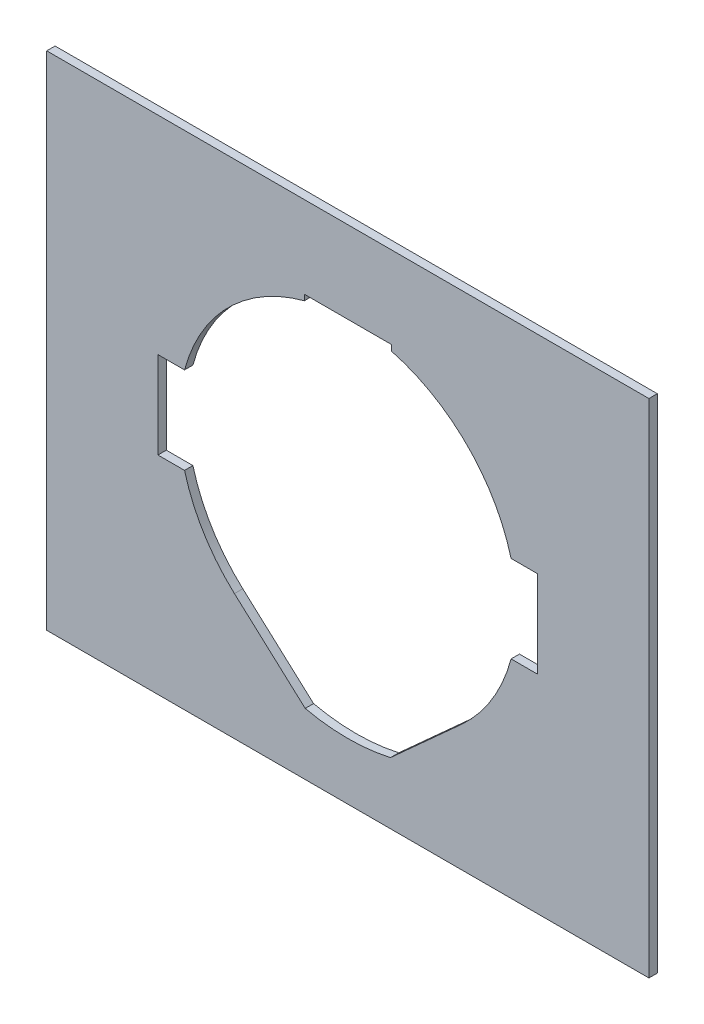
ISO-10303-21;
HEADER;
FILE_DESCRIPTION(('STEP AP214'),'2;1');
FILE_NAME('part.step','',(''),(''),'','','');
FILE_SCHEMA(('AUTOMOTIVE_DESIGN { 1 0 10303 214 1 1 1 1 }'));
ENDSEC;
DATA;
#1=APPLICATION_CONTEXT('core data for automotive mechanical design processes');
#2=APPLICATION_PROTOCOL_DEFINITION('international standard','automotive_design',2000,#1);
#3=PRODUCT_CONTEXT('',#1,'mechanical');
#4=PRODUCT('Part','Part','',(#3));
#5=PRODUCT_RELATED_PRODUCT_CATEGORY('part','',(#4));
#6=PRODUCT_DEFINITION_FORMATION('','',#4);
#7=PRODUCT_DEFINITION_CONTEXT('part definition',#1,'design');
#8=PRODUCT_DEFINITION('design','',#6,#7);
#9=PRODUCT_DEFINITION_SHAPE('','',#8);
#10=(LENGTH_UNIT() NAMED_UNIT(*) SI_UNIT(.MILLI.,.METRE.));
#11=(NAMED_UNIT(*) PLANE_ANGLE_UNIT() SI_UNIT($,.RADIAN.));
#12=(NAMED_UNIT(*) SI_UNIT($,.STERADIAN.) SOLID_ANGLE_UNIT());
#13=UNCERTAINTY_MEASURE_WITH_UNIT(LENGTH_MEASURE(1.E-05),#10,'distance_accuracy_value','');
#14=(GEOMETRIC_REPRESENTATION_CONTEXT(3) GLOBAL_UNCERTAINTY_ASSIGNED_CONTEXT((#13)) GLOBAL_UNIT_ASSIGNED_CONTEXT((#10,
#11,#12)) REPRESENTATION_CONTEXT('',''));
#15=CARTESIAN_POINT('',(0.,0.,0.));
#16=DIRECTION('',(0.,0.,1.));
#17=DIRECTION('',(1.,0.,0.));
#18=AXIS2_PLACEMENT_3D('',#15,#16,#17);
#19=CARTESIAN_POINT('',(360.,300.,10.));
#20=DIRECTION('',(-1.,0.,0.));
#21=DIRECTION('',(0.,0.,1.));
#22=AXIS2_PLACEMENT_3D('',#19,#20,#21);
#23=PLANE('',#22);
#24=DIRECTION('',(0.,1.,0.));
#25=VECTOR('',#24,1.);
#26=CARTESIAN_POINT('',(360.,300.,0.));
#27=LINE('',#26,#25);
#28=CARTESIAN_POINT('',(360.,-300.,0.));
#29=VERTEX_POINT('',#28);
#30=CARTESIAN_POINT('',(360.,300.,0.));
#31=VERTEX_POINT('',#30);
#32=EDGE_CURVE('E313',#29,#31,#27,.T.);
#33=ORIENTED_EDGE('',*,*,#32,.T.);
#34=DIRECTION('',(0.,0.,-1.));
#35=VECTOR('',#34,1.);
#36=CARTESIAN_POINT('',(360.,300.,10.));
#37=LINE('',#36,#35);
#38=CARTESIAN_POINT('',(360.,300.,10.));
#39=VERTEX_POINT('',#38);
#40=EDGE_CURVE('E11',#39,#31,#37,.T.);
#41=ORIENTED_EDGE('',*,*,#40,.F.);
#42=DIRECTION('',(0.,1.,0.));
#43=VECTOR('',#42,1.);
#44=CARTESIAN_POINT('',(360.,300.,10.));
#45=LINE('',#44,#43);
#46=CARTESIAN_POINT('',(360.,-300.,10.));
#47=VERTEX_POINT('',#46);
#48=EDGE_CURVE('E355',#47,#39,#45,.T.);
#49=ORIENTED_EDGE('',*,*,#48,.F.);
#50=DIRECTION('',(0.,0.,-1.));
#51=VECTOR('',#50,1.);
#52=CARTESIAN_POINT('',(360.,-300.,10.));
#53=LINE('',#52,#51);
#54=EDGE_CURVE('E369',#47,#29,#53,.T.);
#55=ORIENTED_EDGE('',*,*,#54,.T.);
#56=EDGE_LOOP('',(#33,#41,#49,#55));
#57=FACE_BOUND('',#56,.T.);
#58=ADVANCED_FACE('F44',(#57),#23,.F.);
#59=CARTESIAN_POINT('',(-360.,300.,10.));
#60=DIRECTION('',(0.,-1.,0.));
#61=DIRECTION('',(0.,0.,-1.));
#62=AXIS2_PLACEMENT_3D('',#59,#60,#61);
#63=PLANE('',#62);
#64=DIRECTION('',(-1.,0.,0.));
#65=VECTOR('',#64,1.);
#66=CARTESIAN_POINT('',(-360.,300.,0.));
#67=LINE('',#66,#65);
#68=CARTESIAN_POINT('',(-360.,300.,0.));
#69=VERTEX_POINT('',#68);
#70=EDGE_CURVE('E373',#31,#69,#67,.T.);
#71=ORIENTED_EDGE('',*,*,#70,.T.);
#72=DIRECTION('',(0.,0.,-1.));
#73=VECTOR('',#72,1.);
#74=CARTESIAN_POINT('',(-360.,300.,10.));
#75=LINE('',#74,#73);
#76=CARTESIAN_POINT('',(-360.,300.,10.));
#77=VERTEX_POINT('',#76);
#78=EDGE_CURVE('E52',#77,#69,#75,.T.);
#79=ORIENTED_EDGE('',*,*,#78,.F.);
#80=DIRECTION('',(-1.,0.,0.));
#81=VECTOR('',#80,1.);
#82=CARTESIAN_POINT('',(-360.,300.,10.));
#83=LINE('',#82,#81);
#84=EDGE_CURVE('E359',#39,#77,#83,.T.);
#85=ORIENTED_EDGE('',*,*,#84,.F.);
#86=ORIENTED_EDGE('',*,*,#40,.T.);
#87=EDGE_LOOP('',(#71,#79,#85,#86));
#88=FACE_BOUND('',#87,.T.);
#89=ADVANCED_FACE('F407',(#88),#63,.F.);
#90=CARTESIAN_POINT('',(-360.,300.,10.));
#91=DIRECTION('',(1.,0.,0.));
#92=DIRECTION('',(0.,1.,0.));
#93=AXIS2_PLACEMENT_3D('',#90,#91,#92);
#94=PLANE('',#93);
#95=DIRECTION('',(0.,-1.,0.));
#96=VECTOR('',#95,1.);
#97=CARTESIAN_POINT('',(-360.,300.,0.));
#98=LINE('',#97,#96);
#99=CARTESIAN_POINT('',(-360.,-300.,0.));
#100=VERTEX_POINT('',#99);
#101=EDGE_CURVE('E376',#69,#100,#98,.T.);
#102=ORIENTED_EDGE('',*,*,#101,.T.);
#103=DIRECTION('',(0.,0.,-1.));
#104=VECTOR('',#103,1.);
#105=CARTESIAN_POINT('',(-360.,-300.,10.));
#106=LINE('',#105,#104);
#107=CARTESIAN_POINT('',(-360.,-300.,10.));
#108=VERTEX_POINT('',#107);
#109=EDGE_CURVE('E384',#108,#100,#106,.T.);
#110=ORIENTED_EDGE('',*,*,#109,.F.);
#111=DIRECTION('',(0.,-1.,0.));
#112=VECTOR('',#111,1.);
#113=CARTESIAN_POINT('',(-360.,300.,10.));
#114=LINE('',#113,#112);
#115=EDGE_CURVE('E363',#77,#108,#114,.T.);
#116=ORIENTED_EDGE('',*,*,#115,.F.);
#117=ORIENTED_EDGE('',*,*,#78,.T.);
#118=EDGE_LOOP('',(#102,#110,#116,#117));
#119=FACE_BOUND('',#118,.T.);
#120=ADVANCED_FACE('F393',(#119),#94,.F.);
#121=CARTESIAN_POINT('',(-360.,-300.,10.));
#122=DIRECTION('',(0.,1.,0.));
#123=DIRECTION('',(0.,0.,1.));
#124=AXIS2_PLACEMENT_3D('',#121,#122,#123);
#125=PLANE('',#124);
#126=DIRECTION('',(1.,0.,0.));
#127=VECTOR('',#126,1.);
#128=CARTESIAN_POINT('',(-360.,-300.,0.));
#129=LINE('',#128,#127);
#130=EDGE_CURVE('E360',#100,#29,#129,.T.);
#131=ORIENTED_EDGE('',*,*,#130,.T.);
#132=ORIENTED_EDGE('',*,*,#54,.F.);
#133=DIRECTION('',(1.,0.,0.));
#134=VECTOR('',#133,1.);
#135=CARTESIAN_POINT('',(-360.,-300.,10.));
#136=LINE('',#135,#134);
#137=EDGE_CURVE('E366',#108,#47,#136,.T.);
#138=ORIENTED_EDGE('',*,*,#137,.F.);
#139=ORIENTED_EDGE('',*,*,#109,.T.);
#140=EDGE_LOOP('',(#131,#132,#138,#139));
#141=FACE_BOUND('',#140,.T.);
#142=ADVANCED_FACE('F400',(#141),#125,.F.);
#143=CARTESIAN_POINT('',(0.,0.,10.));
#144=DIRECTION('',(0.,0.,1.));
#145=DIRECTION('',(1.,0.,0.));
#146=AXIS2_PLACEMENT_3D('',#143,#144,#145);
#147=PLANE('',#146);
#148=DIRECTION('',(0.,1.,0.));
#149=VECTOR('',#148,1.);
#150=CARTESIAN_POINT('',(52.,0.,10.));
#151=LINE('',#150,#149);
#152=CARTESIAN_POINT('',(52.,195.192212959431,10.));
#153=VERTEX_POINT('',#152);
#154=CARTESIAN_POINT('',(52.,202.,10.));
#155=VERTEX_POINT('',#154);
#156=EDGE_CURVE('E59',#153,#155,#151,.T.);
#157=ORIENTED_EDGE('',*,*,#156,.F.);
#158=CARTESIAN_POINT('',(0.,0.,10.));
#159=DIRECTION('',(0.,0.,1.));
#160=DIRECTION('',(1.,0.,0.));
#161=AXIS2_PLACEMENT_3D('',#158,#159,#160);
#162=CIRCLE('',#161,202.);
#163=CARTESIAN_POINT('',(195.192212959431,52.,10.));
#164=VERTEX_POINT('',#163);
#165=EDGE_CURVE('E203',#164,#153,#162,.T.);
#166=ORIENTED_EDGE('',*,*,#165,.F.);
#167=DIRECTION('',(-1.,0.,0.));
#168=VECTOR('',#167,1.);
#169=CARTESIAN_POINT('',(0.,52.,10.));
#170=LINE('',#169,#168);
#171=CARTESIAN_POINT('',(227.,52.,10.));
#172=VERTEX_POINT('',#171);
#173=EDGE_CURVE('E207',#172,#164,#170,.T.);
#174=ORIENTED_EDGE('',*,*,#173,.F.);
#175=DIRECTION('',(0.,1.,0.));
#176=VECTOR('',#175,1.);
#177=CARTESIAN_POINT('',(227.,0.,10.));
#178=LINE('',#177,#176);
#179=CARTESIAN_POINT('',(227.,-52.,10.));
#180=VERTEX_POINT('',#179);
#181=EDGE_CURVE('E303',#180,#172,#178,.T.);
#182=ORIENTED_EDGE('',*,*,#181,.F.);
#183=DIRECTION('',(1.,0.,0.));
#184=VECTOR('',#183,1.);
#185=CARTESIAN_POINT('',(0.,-52.,10.));
#186=LINE('',#185,#184);
#187=CARTESIAN_POINT('',(195.192212959431,-52.,10.));
#188=VERTEX_POINT('',#187);
#189=EDGE_CURVE('E299',#188,#180,#186,.T.);
#190=ORIENTED_EDGE('',*,*,#189,.F.);
#191=CARTESIAN_POINT('',(0.,0.,10.));
#192=DIRECTION('',(0.,0.,1.));
#193=DIRECTION('',(1.,0.,0.));
#194=AXIS2_PLACEMENT_3D('',#191,#192,#193);
#195=CIRCLE('',#194,202.);
#196=CARTESIAN_POINT('',(135.550917147,-149.766314171803,10.));
#197=VERTEX_POINT('',#196);
#198=EDGE_CURVE('E287',#197,#188,#195,.T.);
#199=ORIENTED_EDGE('',*,*,#198,.F.);
#200=DIRECTION('',(0.741417396890114,0.671044144292078,0.));
#201=VECTOR('',#200,1.);
#202=CARTESIAN_POINT('',(135.550917147,-149.766314171803,10.));
#203=LINE('',#202,#201);
#204=CARTESIAN_POINT('',(50.9513259631454,-226.335950265523,10.));
#205=VERTEX_POINT('',#204);
#206=EDGE_CURVE('E295',#205,#197,#203,.T.);
#207=ORIENTED_EDGE('',*,*,#206,.F.);
#208=CARTESIAN_POINT('',(0.,0.,10.));
#209=DIRECTION('',(0.,0.,1.));
#210=DIRECTION('',(1.,0.,0.));
#211=AXIS2_PLACEMENT_3D('',#208,#209,#210);
#212=CIRCLE('',#211,232.);
#213=CARTESIAN_POINT('',(-50.9513259631454,-226.335950265523,10.));
#214=VERTEX_POINT('',#213);
#215=EDGE_CURVE('E291',#214,#205,#212,.T.);
#216=ORIENTED_EDGE('',*,*,#215,.F.);
#217=DIRECTION('',(-0.741417396890114,0.671044144292078,0.));
#218=VECTOR('',#217,1.);
#219=CARTESIAN_POINT('',(-135.550917147,-149.766314171803,10.));
#220=LINE('',#219,#218);
#221=CARTESIAN_POINT('',(-135.550917147,-149.766314171803,10.));
#222=VERTEX_POINT('',#221);
#223=EDGE_CURVE('E286',#214,#222,#220,.T.);
#224=ORIENTED_EDGE('',*,*,#223,.T.);
#225=CARTESIAN_POINT('',(-195.192212959431,-52.,10.));
#226=VERTEX_POINT('',#225);
#227=EDGE_CURVE('E282',#226,#222,#195,.T.);
#228=ORIENTED_EDGE('',*,*,#227,.F.);
#229=DIRECTION('',(1.,0.,0.));
#230=VECTOR('',#229,1.);
#231=CARTESIAN_POINT('',(0.,-52.,10.));
#232=LINE('',#231,#230);
#233=CARTESIAN_POINT('',(-227.,-52.,10.));
#234=VERTEX_POINT('',#233);
#235=EDGE_CURVE('E278',#234,#226,#232,.T.);
#236=ORIENTED_EDGE('',*,*,#235,.F.);
#237=DIRECTION('',(0.,-1.,0.));
#238=VECTOR('',#237,1.);
#239=CARTESIAN_POINT('',(-227.,0.,10.));
#240=LINE('',#239,#238);
#241=CARTESIAN_POINT('',(-227.,52.,10.));
#242=VERTEX_POINT('',#241);
#243=EDGE_CURVE('E274',#242,#234,#240,.T.);
#244=ORIENTED_EDGE('',*,*,#243,.F.);
#245=DIRECTION('',(-1.,0.,0.));
#246=VECTOR('',#245,1.);
#247=CARTESIAN_POINT('',(0.,52.,10.));
#248=LINE('',#247,#246);
#249=CARTESIAN_POINT('',(-195.192212959431,52.,10.));
#250=VERTEX_POINT('',#249);
#251=EDGE_CURVE('E270',#250,#242,#248,.T.);
#252=ORIENTED_EDGE('',*,*,#251,.F.);
#253=CARTESIAN_POINT('',(0.,0.,10.));
#254=DIRECTION('',(0.,0.,1.));
#255=DIRECTION('',(1.,0.,0.));
#256=AXIS2_PLACEMENT_3D('',#253,#254,#255);
#257=CIRCLE('',#256,202.);
#258=CARTESIAN_POINT('',(-52.,195.192212959431,10.));
#259=VERTEX_POINT('',#258);
#260=EDGE_CURVE('E266',#259,#250,#257,.T.);
#261=ORIENTED_EDGE('',*,*,#260,.F.);
#262=DIRECTION('',(0.,-1.,0.));
#263=VECTOR('',#262,1.);
#264=CARTESIAN_POINT('',(-52.,0.,10.));
#265=LINE('',#264,#263);
#266=CARTESIAN_POINT('',(-52.,202.,10.));
#267=VERTEX_POINT('',#266);
#268=EDGE_CURVE('E262',#267,#259,#265,.T.);
#269=ORIENTED_EDGE('',*,*,#268,.F.);
#270=DIRECTION('',(-1.,0.,0.));
#271=VECTOR('',#270,1.);
#272=CARTESIAN_POINT('',(0.,202.,10.));
#273=LINE('',#272,#271);
#274=EDGE_CURVE('E259',#155,#267,#273,.T.);
#275=ORIENTED_EDGE('',*,*,#274,.F.);
#276=EDGE_LOOP('',(#157,#166,#174,#182,#190,#199,#207,#216,#224,#228,#236,#244,#252,#261,#269,#275));
#277=FACE_BOUND('',#276,.T.);
#278=ORIENTED_EDGE('',*,*,#48,.T.);
#279=ORIENTED_EDGE('',*,*,#84,.T.);
#280=ORIENTED_EDGE('',*,*,#115,.T.);
#281=ORIENTED_EDGE('',*,*,#137,.T.);
#282=EDGE_LOOP('',(#278,#279,#280,#281));
#283=FACE_BOUND('',#282,.T.);
#284=ADVANCED_FACE('F406',(#277,#283),#147,.T.);
#285=CARTESIAN_POINT('',(0.,0.,0.));
#286=DIRECTION('',(0.,0.,1.));
#287=DIRECTION('',(1.,0.,0.));
#288=AXIS2_PLACEMENT_3D('',#285,#286,#287);
#289=PLANE('',#288);
#290=CARTESIAN_POINT('',(0.,0.,0.));
#291=DIRECTION('',(0.,0.,1.));
#292=DIRECTION('',(1.,0.,0.));
#293=AXIS2_PLACEMENT_3D('',#290,#291,#292);
#294=CIRCLE('',#293,202.);
#295=CARTESIAN_POINT('',(195.192212959431,52.,0.));
#296=VERTEX_POINT('',#295);
#297=CARTESIAN_POINT('',(52.,195.192212959431,0.));
#298=VERTEX_POINT('',#297);
#299=EDGE_CURVE('E190',#296,#298,#294,.T.);
#300=ORIENTED_EDGE('',*,*,#299,.T.);
#301=DIRECTION('',(0.,1.,0.));
#302=VECTOR('',#301,1.);
#303=CARTESIAN_POINT('',(52.,0.,0.));
#304=LINE('',#303,#302);
#305=CARTESIAN_POINT('',(52.,202.,0.));
#306=VERTEX_POINT('',#305);
#307=EDGE_CURVE('E183',#298,#306,#304,.T.);
#308=ORIENTED_EDGE('',*,*,#307,.T.);
#309=DIRECTION('',(-1.,0.,0.));
#310=VECTOR('',#309,1.);
#311=CARTESIAN_POINT('',(0.,202.,0.));
#312=LINE('',#311,#310);
#313=CARTESIAN_POINT('',(-52.,202.,0.));
#314=VERTEX_POINT('',#313);
#315=EDGE_CURVE('E193',#306,#314,#312,.T.);
#316=ORIENTED_EDGE('',*,*,#315,.T.);
#317=DIRECTION('',(0.,-1.,0.));
#318=VECTOR('',#317,1.);
#319=CARTESIAN_POINT('',(-52.,0.,0.));
#320=LINE('',#319,#318);
#321=CARTESIAN_POINT('',(-52.,195.192212959431,0.));
#322=VERTEX_POINT('',#321);
#323=EDGE_CURVE('E67',#314,#322,#320,.T.);
#324=ORIENTED_EDGE('',*,*,#323,.T.);
#325=CARTESIAN_POINT('',(0.,0.,0.));
#326=DIRECTION('',(0.,0.,1.));
#327=DIRECTION('',(1.,0.,0.));
#328=AXIS2_PLACEMENT_3D('',#325,#326,#327);
#329=CIRCLE('',#328,202.);
#330=CARTESIAN_POINT('',(-195.192212959431,52.,0.));
#331=VERTEX_POINT('',#330);
#332=EDGE_CURVE('E212',#322,#331,#329,.T.);
#333=ORIENTED_EDGE('',*,*,#332,.T.);
#334=DIRECTION('',(-1.,0.,0.));
#335=VECTOR('',#334,1.);
#336=CARTESIAN_POINT('',(0.,52.,0.));
#337=LINE('',#336,#335);
#338=CARTESIAN_POINT('',(-227.,52.,0.));
#339=VERTEX_POINT('',#338);
#340=EDGE_CURVE('E216',#331,#339,#337,.T.);
#341=ORIENTED_EDGE('',*,*,#340,.T.);
#342=DIRECTION('',(0.,-1.,0.));
#343=VECTOR('',#342,1.);
#344=CARTESIAN_POINT('',(-227.,0.,0.));
#345=LINE('',#344,#343);
#346=CARTESIAN_POINT('',(-227.,-52.,0.));
#347=VERTEX_POINT('',#346);
#348=EDGE_CURVE('E220',#339,#347,#345,.T.);
#349=ORIENTED_EDGE('',*,*,#348,.T.);
#350=DIRECTION('',(1.,0.,0.));
#351=VECTOR('',#350,1.);
#352=CARTESIAN_POINT('',(0.,-52.,0.));
#353=LINE('',#352,#351);
#354=CARTESIAN_POINT('',(-195.192212959431,-52.,0.));
#355=VERTEX_POINT('',#354);
#356=EDGE_CURVE('E224',#347,#355,#353,.T.);
#357=ORIENTED_EDGE('',*,*,#356,.T.);
#358=CARTESIAN_POINT('',(0.,0.,0.));
#359=DIRECTION('',(0.,0.,1.));
#360=DIRECTION('',(1.,0.,0.));
#361=AXIS2_PLACEMENT_3D('',#358,#359,#360);
#362=CIRCLE('',#361,202.);
#363=CARTESIAN_POINT('',(-135.550917147,-149.766314171803,0.));
#364=VERTEX_POINT('',#363);
#365=EDGE_CURVE('E228',#355,#364,#362,.T.);
#366=ORIENTED_EDGE('',*,*,#365,.T.);
#367=DIRECTION('',(-0.741417396890114,0.671044144292078,0.));
#368=VECTOR('',#367,1.);
#369=CARTESIAN_POINT('',(-135.550917147,-149.766314171803,0.));
#370=LINE('',#369,#368);
#371=CARTESIAN_POINT('',(-50.9513259631454,-226.335950265523,0.));
#372=VERTEX_POINT('',#371);
#373=EDGE_CURVE('E232',#372,#364,#370,.T.);
#374=ORIENTED_EDGE('',*,*,#373,.F.);
#375=CARTESIAN_POINT('',(0.,0.,0.));
#376=DIRECTION('',(0.,0.,1.));
#377=DIRECTION('',(1.,0.,0.));
#378=AXIS2_PLACEMENT_3D('',#375,#376,#377);
#379=CIRCLE('',#378,232.);
#380=CARTESIAN_POINT('',(50.9513259631454,-226.335950265523,0.));
#381=VERTEX_POINT('',#380);
#382=EDGE_CURVE('E236',#372,#381,#379,.T.);
#383=ORIENTED_EDGE('',*,*,#382,.T.);
#384=DIRECTION('',(0.741417396890114,0.671044144292078,0.));
#385=VECTOR('',#384,1.);
#386=CARTESIAN_POINT('',(135.550917147,-149.766314171803,0.));
#387=LINE('',#386,#385);
#388=CARTESIAN_POINT('',(135.550917147,-149.766314171803,0.));
#389=VERTEX_POINT('',#388);
#390=EDGE_CURVE('E240',#381,#389,#387,.T.);
#391=ORIENTED_EDGE('',*,*,#390,.T.);
#392=CARTESIAN_POINT('',(195.192212959431,-52.,0.));
#393=VERTEX_POINT('',#392);
#394=EDGE_CURVE('E233',#389,#393,#362,.T.);
#395=ORIENTED_EDGE('',*,*,#394,.T.);
#396=DIRECTION('',(1.,0.,0.));
#397=VECTOR('',#396,1.);
#398=CARTESIAN_POINT('',(0.,-52.,0.));
#399=LINE('',#398,#397);
#400=CARTESIAN_POINT('',(227.,-52.,0.));
#401=VERTEX_POINT('',#400);
#402=EDGE_CURVE('E244',#393,#401,#399,.T.);
#403=ORIENTED_EDGE('',*,*,#402,.T.);
#404=DIRECTION('',(0.,1.,0.));
#405=VECTOR('',#404,1.);
#406=CARTESIAN_POINT('',(227.,0.,0.));
#407=LINE('',#406,#405);
#408=CARTESIAN_POINT('',(227.,52.,0.));
#409=VERTEX_POINT('',#408);
#410=EDGE_CURVE('E248',#401,#409,#407,.T.);
#411=ORIENTED_EDGE('',*,*,#410,.T.);
#412=DIRECTION('',(-1.,0.,0.));
#413=VECTOR('',#412,1.);
#414=CARTESIAN_POINT('',(0.,52.,0.));
#415=LINE('',#414,#413);
#416=EDGE_CURVE('E252',#409,#296,#415,.T.);
#417=ORIENTED_EDGE('',*,*,#416,.T.);
#418=EDGE_LOOP('',(#300,#308,#316,#324,#333,#341,#349,#357,#366,#374,#383,#391,#395,#403,#411,#417));
#419=FACE_BOUND('',#418,.T.);
#420=ORIENTED_EDGE('',*,*,#32,.F.);
#421=ORIENTED_EDGE('',*,*,#130,.F.);
#422=ORIENTED_EDGE('',*,*,#101,.F.);
#423=ORIENTED_EDGE('',*,*,#70,.F.);
#424=EDGE_LOOP('',(#420,#421,#422,#423));
#425=FACE_BOUND('',#424,.T.);
#426=ADVANCED_FACE('F198',(#419,#425),#289,.F.);
#427=CARTESIAN_POINT('',(52.,0.,0.));
#428=DIRECTION('',(1.,0.,0.));
#429=DIRECTION('',(0.,0.,-1.));
#430=AXIS2_PLACEMENT_3D('',#427,#428,#429);
#431=PLANE('',#430);
#432=ORIENTED_EDGE('',*,*,#156,.T.);
#433=DIRECTION('',(0.,0.,1.));
#434=VECTOR('',#433,1.);
#435=CARTESIAN_POINT('',(52.,202.,0.));
#436=LINE('',#435,#434);
#437=EDGE_CURVE('E179',#306,#155,#436,.T.);
#438=ORIENTED_EDGE('',*,*,#437,.F.);
#439=ORIENTED_EDGE('',*,*,#307,.F.);
#440=DIRECTION('',(0.,0.,1.));
#441=VECTOR('',#440,1.);
#442=CARTESIAN_POINT('',(52.,195.192212959431,0.));
#443=LINE('',#442,#441);
#444=EDGE_CURVE('E310',#298,#153,#443,.T.);
#445=ORIENTED_EDGE('',*,*,#444,.T.);
#446=EDGE_LOOP('',(#432,#438,#439,#445));
#447=FACE_BOUND('',#446,.T.);
#448=ADVANCED_FACE('F181',(#447),#431,.F.);
#449=CARTESIAN_POINT('',(0.,0.,0.));
#450=DIRECTION('',(0.,0.,1.));
#451=DIRECTION('',(1.,0.,0.));
#452=AXIS2_PLACEMENT_3D('',#449,#450,#451);
#453=CYLINDRICAL_SURFACE('',#452,202.);
#454=ORIENTED_EDGE('',*,*,#165,.T.);
#455=ORIENTED_EDGE('',*,*,#444,.F.);
#456=ORIENTED_EDGE('',*,*,#299,.F.);
#457=DIRECTION('',(0.,0.,1.));
#458=VECTOR('',#457,1.);
#459=CARTESIAN_POINT('',(195.192212959431,52.,0.));
#460=LINE('',#459,#458);
#461=EDGE_CURVE('E314',#296,#164,#460,.T.);
#462=ORIENTED_EDGE('',*,*,#461,.T.);
#463=EDGE_LOOP('',(#454,#455,#456,#462));
#464=FACE_BOUND('',#463,.T.);
#465=ADVANCED_FACE('F424',(#464),#453,.F.);
#466=CARTESIAN_POINT('',(0.,52.,0.));
#467=DIRECTION('',(0.,1.,0.));
#468=DIRECTION('',(0.,0.,1.));
#469=AXIS2_PLACEMENT_3D('',#466,#467,#468);
#470=PLANE('',#469);
#471=ORIENTED_EDGE('',*,*,#173,.T.);
#472=ORIENTED_EDGE('',*,*,#461,.F.);
#473=ORIENTED_EDGE('',*,*,#416,.F.);
#474=DIRECTION('',(0.,0.,1.));
#475=VECTOR('',#474,1.);
#476=CARTESIAN_POINT('',(227.,52.,0.));
#477=LINE('',#476,#475);
#478=EDGE_CURVE('E317',#409,#172,#477,.T.);
#479=ORIENTED_EDGE('',*,*,#478,.T.);
#480=EDGE_LOOP('',(#471,#472,#473,#479));
#481=FACE_BOUND('',#480,.T.);
#482=ADVANCED_FACE('F470',(#481),#470,.F.);
#483=CARTESIAN_POINT('',(227.,0.,0.));
#484=DIRECTION('',(1.,0.,0.));
#485=DIRECTION('',(0.,0.,-1.));
#486=AXIS2_PLACEMENT_3D('',#483,#484,#485);
#487=PLANE('',#486);
#488=ORIENTED_EDGE('',*,*,#181,.T.);
#489=ORIENTED_EDGE('',*,*,#478,.F.);
#490=ORIENTED_EDGE('',*,*,#410,.F.);
#491=DIRECTION('',(0.,0.,1.));
#492=VECTOR('',#491,1.);
#493=CARTESIAN_POINT('',(227.,-52.,0.));
#494=LINE('',#493,#492);
#495=EDGE_CURVE('E320',#401,#180,#494,.T.);
#496=ORIENTED_EDGE('',*,*,#495,.T.);
#497=EDGE_LOOP('',(#488,#489,#490,#496));
#498=FACE_BOUND('',#497,.T.);
#499=ADVANCED_FACE('F466',(#498),#487,.F.);
#500=CARTESIAN_POINT('',(0.,-52.,0.));
#501=DIRECTION('',(0.,-1.,0.));
#502=DIRECTION('',(0.,0.,-1.));
#503=AXIS2_PLACEMENT_3D('',#500,#501,#502);
#504=PLANE('',#503);
#505=ORIENTED_EDGE('',*,*,#189,.T.);
#506=ORIENTED_EDGE('',*,*,#495,.F.);
#507=ORIENTED_EDGE('',*,*,#402,.F.);
#508=DIRECTION('',(0.,0.,1.));
#509=VECTOR('',#508,1.);
#510=CARTESIAN_POINT('',(195.192212959431,-52.,0.));
#511=LINE('',#510,#509);
#512=EDGE_CURVE('E323',#393,#188,#511,.T.);
#513=ORIENTED_EDGE('',*,*,#512,.T.);
#514=EDGE_LOOP('',(#505,#506,#507,#513));
#515=FACE_BOUND('',#514,.T.);
#516=ADVANCED_FACE('F462',(#515),#504,.F.);
#517=CARTESIAN_POINT('',(0.,0.,0.));
#518=DIRECTION('',(0.,0.,1.));
#519=DIRECTION('',(1.,0.,0.));
#520=AXIS2_PLACEMENT_3D('',#517,#518,#519);
#521=CYLINDRICAL_SURFACE('',#520,202.);
#522=ORIENTED_EDGE('',*,*,#198,.T.);
#523=ORIENTED_EDGE('',*,*,#512,.F.);
#524=ORIENTED_EDGE('',*,*,#394,.F.);
#525=DIRECTION('',(0.,0.,1.));
#526=VECTOR('',#525,1.);
#527=CARTESIAN_POINT('',(135.550917147,-149.766314171803,0.));
#528=LINE('',#527,#526);
#529=EDGE_CURVE('E326',#389,#197,#528,.T.);
#530=ORIENTED_EDGE('',*,*,#529,.T.);
#531=EDGE_LOOP('',(#522,#523,#524,#530));
#532=FACE_BOUND('',#531,.T.);
#533=ADVANCED_FACE('F458',(#532),#521,.F.);
#534=CARTESIAN_POINT('',(135.550917147,-149.766314171803,0.));
#535=DIRECTION('',(0.671044144292078,-0.741417396890114,0.));
#536=DIRECTION('',(0.741417396890114,0.671044144292078,0.));
#537=AXIS2_PLACEMENT_3D('',#534,#535,#536);
#538=PLANE('',#537);
#539=ORIENTED_EDGE('',*,*,#206,.T.);
#540=ORIENTED_EDGE('',*,*,#529,.F.);
#541=ORIENTED_EDGE('',*,*,#390,.F.);
#542=DIRECTION('',(0.,0.,1.));
#543=VECTOR('',#542,1.);
#544=CARTESIAN_POINT('',(50.9513259631454,-226.335950265523,0.));
#545=LINE('',#544,#543);
#546=EDGE_CURVE('E329',#381,#205,#545,.T.);
#547=ORIENTED_EDGE('',*,*,#546,.T.);
#548=EDGE_LOOP('',(#539,#540,#541,#547));
#549=FACE_BOUND('',#548,.T.);
#550=ADVANCED_FACE('F454',(#549),#538,.F.);
#551=CARTESIAN_POINT('',(0.,0.,0.));
#552=DIRECTION('',(0.,0.,1.));
#553=DIRECTION('',(1.,0.,0.));
#554=AXIS2_PLACEMENT_3D('',#551,#552,#553);
#555=CYLINDRICAL_SURFACE('',#554,232.);
#556=ORIENTED_EDGE('',*,*,#215,.T.);
#557=ORIENTED_EDGE('',*,*,#546,.F.);
#558=ORIENTED_EDGE('',*,*,#382,.F.);
#559=DIRECTION('',(0.,0.,1.));
#560=VECTOR('',#559,1.);
#561=CARTESIAN_POINT('',(-50.9513259631454,-226.335950265523,0.));
#562=LINE('',#561,#560);
#563=EDGE_CURVE('E332',#372,#214,#562,.T.);
#564=ORIENTED_EDGE('',*,*,#563,.T.);
#565=EDGE_LOOP('',(#556,#557,#558,#564));
#566=FACE_BOUND('',#565,.T.);
#567=ADVANCED_FACE('F450',(#566),#555,.F.);
#568=CARTESIAN_POINT('',(-135.550917147,-149.766314171803,0.));
#569=DIRECTION('',(0.671044144292078,0.741417396890114,0.));
#570=DIRECTION('',(-0.741417396890114,0.671044144292078,0.));
#571=AXIS2_PLACEMENT_3D('',#568,#569,#570);
#572=PLANE('',#571);
#573=ORIENTED_EDGE('',*,*,#223,.F.);
#574=ORIENTED_EDGE('',*,*,#563,.F.);
#575=ORIENTED_EDGE('',*,*,#373,.T.);
#576=DIRECTION('',(0.,0.,1.));
#577=VECTOR('',#576,1.);
#578=CARTESIAN_POINT('',(-135.550917147,-149.766314171803,0.));
#579=LINE('',#578,#577);
#580=EDGE_CURVE('E335',#364,#222,#579,.T.);
#581=ORIENTED_EDGE('',*,*,#580,.T.);
#582=EDGE_LOOP('',(#573,#574,#575,#581));
#583=FACE_BOUND('',#582,.T.);
#584=ADVANCED_FACE('F447',(#583),#572,.T.);
#585=ORIENTED_EDGE('',*,*,#227,.T.);
#586=ORIENTED_EDGE('',*,*,#580,.F.);
#587=ORIENTED_EDGE('',*,*,#365,.F.);
#588=DIRECTION('',(0.,0.,1.));
#589=VECTOR('',#588,1.);
#590=CARTESIAN_POINT('',(-195.192212959431,-52.,0.));
#591=LINE('',#590,#589);
#592=EDGE_CURVE('E338',#355,#226,#591,.T.);
#593=ORIENTED_EDGE('',*,*,#592,.T.);
#594=EDGE_LOOP('',(#585,#586,#587,#593));
#595=FACE_BOUND('',#594,.T.);
#596=ADVANCED_FACE('F445',(#595),#521,.F.);
#597=CARTESIAN_POINT('',(0.,-52.,0.));
#598=DIRECTION('',(0.,-1.,0.));
#599=DIRECTION('',(0.,0.,-1.));
#600=AXIS2_PLACEMENT_3D('',#597,#598,#599);
#601=PLANE('',#600);
#602=ORIENTED_EDGE('',*,*,#235,.T.);
#603=ORIENTED_EDGE('',*,*,#592,.F.);
#604=ORIENTED_EDGE('',*,*,#356,.F.);
#605=DIRECTION('',(0.,0.,1.));
#606=VECTOR('',#605,1.);
#607=CARTESIAN_POINT('',(-227.,-52.,0.));
#608=LINE('',#607,#606);
#609=EDGE_CURVE('E341',#347,#234,#608,.T.);
#610=ORIENTED_EDGE('',*,*,#609,.T.);
#611=EDGE_LOOP('',(#602,#603,#604,#610));
#612=FACE_BOUND('',#611,.T.);
#613=ADVANCED_FACE('F441',(#612),#601,.F.);
#614=CARTESIAN_POINT('',(-227.,0.,0.));
#615=DIRECTION('',(-1.,0.,0.));
#616=DIRECTION('',(0.,0.,1.));
#617=AXIS2_PLACEMENT_3D('',#614,#615,#616);
#618=PLANE('',#617);
#619=ORIENTED_EDGE('',*,*,#243,.T.);
#620=ORIENTED_EDGE('',*,*,#609,.F.);
#621=ORIENTED_EDGE('',*,*,#348,.F.);
#622=DIRECTION('',(0.,0.,1.));
#623=VECTOR('',#622,1.);
#624=CARTESIAN_POINT('',(-227.,52.,0.));
#625=LINE('',#624,#623);
#626=EDGE_CURVE('E344',#339,#242,#625,.T.);
#627=ORIENTED_EDGE('',*,*,#626,.T.);
#628=EDGE_LOOP('',(#619,#620,#621,#627));
#629=FACE_BOUND('',#628,.T.);
#630=ADVANCED_FACE('F437',(#629),#618,.F.);
#631=CARTESIAN_POINT('',(0.,52.,0.));
#632=DIRECTION('',(0.,1.,0.));
#633=DIRECTION('',(0.,0.,1.));
#634=AXIS2_PLACEMENT_3D('',#631,#632,#633);
#635=PLANE('',#634);
#636=ORIENTED_EDGE('',*,*,#251,.T.);
#637=ORIENTED_EDGE('',*,*,#626,.F.);
#638=ORIENTED_EDGE('',*,*,#340,.F.);
#639=DIRECTION('',(0.,0.,1.));
#640=VECTOR('',#639,1.);
#641=CARTESIAN_POINT('',(-195.192212959431,52.,0.));
#642=LINE('',#641,#640);
#643=EDGE_CURVE('E347',#331,#250,#642,.T.);
#644=ORIENTED_EDGE('',*,*,#643,.T.);
#645=EDGE_LOOP('',(#636,#637,#638,#644));
#646=FACE_BOUND('',#645,.T.);
#647=ADVANCED_FACE('F433',(#646),#635,.F.);
#648=CARTESIAN_POINT('',(0.,0.,0.));
#649=DIRECTION('',(0.,0.,1.));
#650=DIRECTION('',(1.,0.,0.));
#651=AXIS2_PLACEMENT_3D('',#648,#649,#650);
#652=CYLINDRICAL_SURFACE('',#651,202.);
#653=ORIENTED_EDGE('',*,*,#260,.T.);
#654=ORIENTED_EDGE('',*,*,#643,.F.);
#655=ORIENTED_EDGE('',*,*,#332,.F.);
#656=DIRECTION('',(0.,0.,1.));
#657=VECTOR('',#656,1.);
#658=CARTESIAN_POINT('',(-52.,195.192212959431,0.));
#659=LINE('',#658,#657);
#660=EDGE_CURVE('E350',#322,#259,#659,.T.);
#661=ORIENTED_EDGE('',*,*,#660,.T.);
#662=EDGE_LOOP('',(#653,#654,#655,#661));
#663=FACE_BOUND('',#662,.T.);
#664=ADVANCED_FACE('F430',(#663),#652,.F.);
#665=CARTESIAN_POINT('',(-52.,0.,0.));
#666=DIRECTION('',(-1.,0.,0.));
#667=DIRECTION('',(0.,0.,1.));
#668=AXIS2_PLACEMENT_3D('',#665,#666,#667);
#669=PLANE('',#668);
#670=ORIENTED_EDGE('',*,*,#268,.T.);
#671=ORIENTED_EDGE('',*,*,#660,.F.);
#672=ORIENTED_EDGE('',*,*,#323,.F.);
#673=DIRECTION('',(0.,0.,1.));
#674=VECTOR('',#673,1.);
#675=CARTESIAN_POINT('',(-52.,202.,0.));
#676=LINE('',#675,#674);
#677=EDGE_CURVE('E189',#314,#267,#676,.T.);
#678=ORIENTED_EDGE('',*,*,#677,.T.);
#679=EDGE_LOOP('',(#670,#671,#672,#678));
#680=FACE_BOUND('',#679,.T.);
#681=ADVANCED_FACE('F427',(#680),#669,.F.);
#682=CARTESIAN_POINT('',(0.,202.,0.));
#683=DIRECTION('',(0.,1.,0.));
#684=DIRECTION('',(0.,0.,1.));
#685=AXIS2_PLACEMENT_3D('',#682,#683,#684);
#686=PLANE('',#685);
#687=ORIENTED_EDGE('',*,*,#274,.T.);
#688=ORIENTED_EDGE('',*,*,#677,.F.);
#689=ORIENTED_EDGE('',*,*,#315,.F.);
#690=ORIENTED_EDGE('',*,*,#437,.T.);
#691=EDGE_LOOP('',(#687,#688,#689,#690));
#692=FACE_BOUND('',#691,.T.);
#693=ADVANCED_FACE('F194',(#692),#686,.F.);
#694=CLOSED_SHELL('',(#58,#89,#120,#142,#284,#426,#448,#465,#482,#499,#516,#533,#550,#567,#584,
#596,#613,#630,#647,#664,#681,#693));
#695=MANIFOLD_SOLID_BREP('B2',#694);
#696=ADVANCED_BREP_SHAPE_REPRESENTATION('',(#18,#695),#14);
#697=SHAPE_DEFINITION_REPRESENTATION(#9,#696);
ENDSEC;
END-ISO-10303-21;
